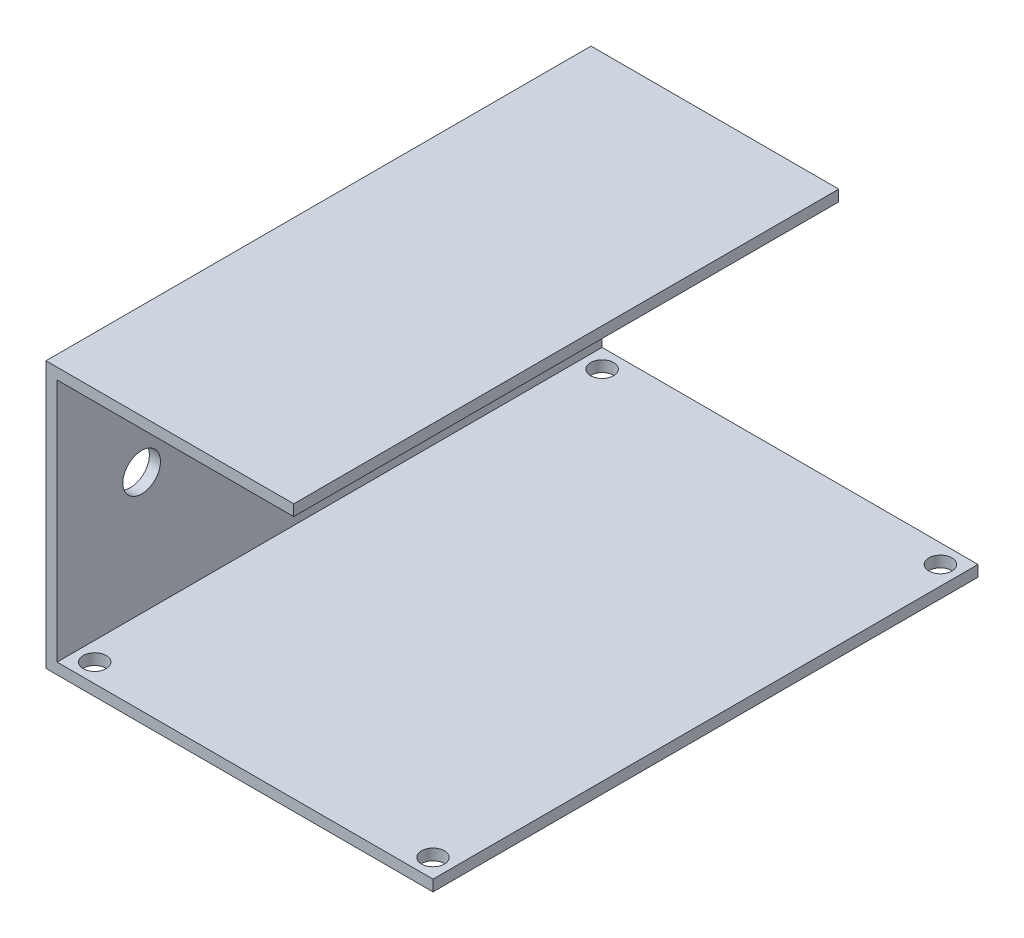
ISO-10303-21;
HEADER;
FILE_DESCRIPTION(('STEP AP214'),'2;1');
FILE_NAME('part.step','',(''),(''),'','','');
FILE_SCHEMA(('AUTOMOTIVE_DESIGN { 1 0 10303 214 1 1 1 1 }'));
ENDSEC;
DATA;
#1=APPLICATION_CONTEXT('core data for automotive mechanical design processes');
#2=APPLICATION_PROTOCOL_DEFINITION('international standard','automotive_design',2000,#1);
#3=PRODUCT_CONTEXT('',#1,'mechanical');
#4=PRODUCT('Part','Part','',(#3));
#5=PRODUCT_RELATED_PRODUCT_CATEGORY('part','',(#4));
#6=PRODUCT_DEFINITION_FORMATION('','',#4);
#7=PRODUCT_DEFINITION_CONTEXT('part definition',#1,'design');
#8=PRODUCT_DEFINITION('design','',#6,#7);
#9=PRODUCT_DEFINITION_SHAPE('','',#8);
#10=(LENGTH_UNIT() NAMED_UNIT(*) SI_UNIT(.MILLI.,.METRE.));
#11=(NAMED_UNIT(*) PLANE_ANGLE_UNIT() SI_UNIT($,.RADIAN.));
#12=(NAMED_UNIT(*) SI_UNIT($,.STERADIAN.) SOLID_ANGLE_UNIT());
#13=UNCERTAINTY_MEASURE_WITH_UNIT(LENGTH_MEASURE(1.E-05),#10,'distance_accuracy_value','');
#14=(GEOMETRIC_REPRESENTATION_CONTEXT(3) GLOBAL_UNCERTAINTY_ASSIGNED_CONTEXT((#13)) GLOBAL_UNIT_ASSIGNED_CONTEXT((#10,
#11,#12)) REPRESENTATION_CONTEXT('',''));
#15=CARTESIAN_POINT('',(0.,0.,0.));
#16=DIRECTION('',(0.,0.,1.));
#17=DIRECTION('',(1.,0.,0.));
#18=AXIS2_PLACEMENT_3D('',#15,#16,#17);
#19=CARTESIAN_POINT('',(-25.4,34.52,-36.83));
#20=DIRECTION('',(-1.,0.,0.));
#21=DIRECTION('',(0.,0.,1.));
#22=AXIS2_PLACEMENT_3D('',#19,#20,#21);
#23=PLANE('',#22);
#24=CARTESIAN_POINT('',(-25.4,18.01,0.));
#25=DIRECTION('',(1.,0.,0.));
#26=DIRECTION('',(0.,0.,-1.));
#27=AXIS2_PLACEMENT_3D('',#24,#25,#26);
#28=CIRCLE('',#27,5.334);
#29=CARTESIAN_POINT('',(-25.4,18.01,-5.334));
#30=VERTEX_POINT('',#29);
#31=EDGE_CURVE('E151',#30,#30,#28,.T.);
#32=ORIENTED_EDGE('',*,*,#31,.F.);
#33=EDGE_LOOP('',(#32));
#34=FACE_BOUND('',#33,.T.);
#35=CARTESIAN_POINT('',(-25.4,18.01,-12.7));
#36=DIRECTION('',(1.,0.,0.));
#37=DIRECTION('',(0.,0.,-1.));
#38=AXIS2_PLACEMENT_3D('',#35,#36,#37);
#39=CIRCLE('',#38,2.54);
#40=CARTESIAN_POINT('',(-25.4,18.01,-15.24));
#41=VERTEX_POINT('',#40);
#42=EDGE_CURVE('E154',#41,#41,#39,.T.);
#43=ORIENTED_EDGE('',*,*,#42,.F.);
#44=EDGE_LOOP('',(#43));
#45=FACE_BOUND('',#44,.T.);
#46=CARTESIAN_POINT('',(-25.4,18.01,-25.4));
#47=DIRECTION('',(1.,0.,0.));
#48=DIRECTION('',(0.,0.,-1.));
#49=AXIS2_PLACEMENT_3D('',#46,#47,#48);
#50=CIRCLE('',#49,2.54);
#51=CARTESIAN_POINT('',(-25.4,18.01,-27.94));
#52=VERTEX_POINT('',#51);
#53=EDGE_CURVE('E162',#52,#52,#50,.T.);
#54=ORIENTED_EDGE('',*,*,#53,.F.);
#55=EDGE_LOOP('',(#54));
#56=FACE_BOUND('',#55,.T.);
#57=CARTESIAN_POINT('',(-25.4,18.01,25.4));
#58=DIRECTION('',(1.,0.,0.));
#59=DIRECTION('',(0.,0.,-1.));
#60=AXIS2_PLACEMENT_3D('',#57,#58,#59);
#61=CIRCLE('',#60,2.54);
#62=CARTESIAN_POINT('',(-25.4,18.01,22.86));
#63=VERTEX_POINT('',#62);
#64=EDGE_CURVE('E158',#63,#63,#61,.T.);
#65=ORIENTED_EDGE('',*,*,#64,.F.);
#66=EDGE_LOOP('',(#65));
#67=FACE_BOUND('',#66,.T.);
#68=CARTESIAN_POINT('',(-25.4,18.01,12.7));
#69=DIRECTION('',(1.,0.,0.));
#70=DIRECTION('',(0.,0.,-1.));
#71=AXIS2_PLACEMENT_3D('',#68,#69,#70);
#72=CIRCLE('',#71,2.54);
#73=CARTESIAN_POINT('',(-25.4,18.01,10.16));
#74=VERTEX_POINT('',#73);
#75=EDGE_CURVE('E155',#74,#74,#72,.T.);
#76=ORIENTED_EDGE('',*,*,#75,.F.);
#77=EDGE_LOOP('',(#76));
#78=FACE_BOUND('',#77,.T.);
#79=DIRECTION('',(0.,0.,-1.));
#80=VECTOR('',#79,1.);
#81=CARTESIAN_POINT('',(-25.4,34.52,36.83));
#82=LINE('',#81,#80);
#83=CARTESIAN_POINT('',(-25.4,34.52,36.83));
#84=VERTEX_POINT('',#83);
#85=CARTESIAN_POINT('',(-25.4,34.52,-36.83));
#86=VERTEX_POINT('',#85);
#87=EDGE_CURVE('E182',#84,#86,#82,.T.);
#88=ORIENTED_EDGE('',*,*,#87,.F.);
#89=DIRECTION('',(0.,-1.,0.));
#90=VECTOR('',#89,1.);
#91=CARTESIAN_POINT('',(-25.4,34.52,36.83));
#92=LINE('',#91,#90);
#93=CARTESIAN_POINT('',(-25.4,1.5,36.83));
#94=VERTEX_POINT('',#93);
#95=EDGE_CURVE('E49',#84,#94,#92,.T.);
#96=ORIENTED_EDGE('',*,*,#95,.T.);
#97=DIRECTION('',(0.,0.,-1.));
#98=VECTOR('',#97,1.);
#99=CARTESIAN_POINT('',(-25.4,1.5,-36.83));
#100=LINE('',#99,#98);
#101=CARTESIAN_POINT('',(-25.4,1.5,-36.83));
#102=VERTEX_POINT('',#101);
#103=EDGE_CURVE('E134',#94,#102,#100,.T.);
#104=ORIENTED_EDGE('',*,*,#103,.T.);
#105=DIRECTION('',(0.,-1.,0.));
#106=VECTOR('',#105,1.);
#107=CARTESIAN_POINT('',(-25.4,34.52,-36.83));
#108=LINE('',#107,#106);
#109=EDGE_CURVE('E132',#86,#102,#108,.T.);
#110=ORIENTED_EDGE('',*,*,#109,.F.);
#111=EDGE_LOOP('',(#88,#96,#104,#110));
#112=FACE_BOUND('',#111,.T.);
#113=ADVANCED_FACE('F34',(#34,#45,#56,#67,#78,#112),#23,.F.);
#114=CARTESIAN_POINT('',(0.,1.5,0.));
#115=DIRECTION('',(0.,1.,0.));
#116=DIRECTION('',(0.,0.,1.));
#117=AXIS2_PLACEMENT_3D('',#114,#115,#116);
#118=PLANE('',#117);
#119=ORIENTED_EDGE('',*,*,#103,.F.);
#120=DIRECTION('',(1.,0.,0.));
#121=VECTOR('',#120,1.);
#122=CARTESIAN_POINT('',(25.4,1.5,36.83));
#123=LINE('',#122,#121);
#124=CARTESIAN_POINT('',(25.4,1.5,36.83));
#125=VERTEX_POINT('',#124);
#126=EDGE_CURVE('E94',#94,#125,#123,.T.);
#127=ORIENTED_EDGE('',*,*,#126,.T.);
#128=DIRECTION('',(0.,0.,-1.));
#129=VECTOR('',#128,1.);
#130=CARTESIAN_POINT('',(25.4,1.5,36.83));
#131=LINE('',#130,#129);
#132=CARTESIAN_POINT('',(25.4,1.5,-36.83));
#133=VERTEX_POINT('',#132);
#134=EDGE_CURVE('E58',#125,#133,#131,.T.);
#135=ORIENTED_EDGE('',*,*,#134,.T.);
#136=DIRECTION('',(-1.,0.,0.));
#137=VECTOR('',#136,1.);
#138=CARTESIAN_POINT('',(25.4,1.5,-36.83));
#139=LINE('',#138,#137);
#140=EDGE_CURVE('E88',#133,#102,#139,.T.);
#141=ORIENTED_EDGE('',*,*,#140,.T.);
#142=EDGE_LOOP('',(#119,#127,#135,#141));
#143=FACE_BOUND('',#142,.T.);
#144=CARTESIAN_POINT('',(22.86,1.5,34.29));
#145=DIRECTION('',(0.,1.,0.));
#146=DIRECTION('',(0.,0.,1.));
#147=AXIS2_PLACEMENT_3D('',#144,#145,#146);
#148=CIRCLE('',#147,1.55);
#149=CARTESIAN_POINT('',(22.86,1.5,35.84));
#150=VERTEX_POINT('',#149);
#151=EDGE_CURVE('E111',#150,#150,#148,.T.);
#152=ORIENTED_EDGE('',*,*,#151,.F.);
#153=EDGE_LOOP('',(#152));
#154=FACE_BOUND('',#153,.T.);
#155=CARTESIAN_POINT('',(-22.86,1.5,-34.29));
#156=DIRECTION('',(0.,1.,0.));
#157=DIRECTION('',(0.,0.,1.));
#158=AXIS2_PLACEMENT_3D('',#155,#156,#157);
#159=CIRCLE('',#158,1.55);
#160=CARTESIAN_POINT('',(-22.86,1.5,-32.74));
#161=VERTEX_POINT('',#160);
#162=EDGE_CURVE('E99',#161,#161,#159,.T.);
#163=ORIENTED_EDGE('',*,*,#162,.F.);
#164=EDGE_LOOP('',(#163));
#165=FACE_BOUND('',#164,.T.);
#166=CARTESIAN_POINT('',(22.86,1.5,-34.29));
#167=DIRECTION('',(0.,1.,0.));
#168=DIRECTION('',(0.,0.,1.));
#169=AXIS2_PLACEMENT_3D('',#166,#167,#168);
#170=CIRCLE('',#169,1.55);
#171=CARTESIAN_POINT('',(22.86,1.5,-32.74));
#172=VERTEX_POINT('',#171);
#173=EDGE_CURVE('E105',#172,#172,#170,.T.);
#174=ORIENTED_EDGE('',*,*,#173,.F.);
#175=EDGE_LOOP('',(#174));
#176=FACE_BOUND('',#175,.T.);
#177=CARTESIAN_POINT('',(-22.86,1.5,34.29));
#178=DIRECTION('',(0.,1.,0.));
#179=DIRECTION('',(0.,0.,1.));
#180=AXIS2_PLACEMENT_3D('',#177,#178,#179);
#181=CIRCLE('',#180,1.55);
#182=CARTESIAN_POINT('',(-22.86,1.5,35.84));
#183=VERTEX_POINT('',#182);
#184=EDGE_CURVE('E117',#183,#183,#181,.T.);
#185=ORIENTED_EDGE('',*,*,#184,.F.);
#186=EDGE_LOOP('',(#185));
#187=FACE_BOUND('',#186,.T.);
#188=ADVANCED_FACE('F220',(#143,#154,#165,#176,#187),#118,.T.);
#189=CARTESIAN_POINT('',(0.,0.,0.));
#190=DIRECTION('',(0.,1.,0.));
#191=DIRECTION('',(0.,0.,1.));
#192=AXIS2_PLACEMENT_3D('',#189,#190,#191);
#193=PLANE('',#192);
#194=DIRECTION('',(1.,0.,0.));
#195=VECTOR('',#194,1.);
#196=CARTESIAN_POINT('',(25.4,0.,36.83));
#197=LINE('',#196,#195);
#198=CARTESIAN_POINT('',(-26.9,0.,36.83));
#199=VERTEX_POINT('',#198);
#200=CARTESIAN_POINT('',(25.4,0.,36.83));
#201=VERTEX_POINT('',#200);
#202=EDGE_CURVE('E79',#199,#201,#197,.T.);
#203=ORIENTED_EDGE('',*,*,#202,.F.);
#204=DIRECTION('',(0.,0.,1.));
#205=VECTOR('',#204,1.);
#206=CARTESIAN_POINT('',(-26.9,0.,-36.83));
#207=LINE('',#206,#205);
#208=CARTESIAN_POINT('',(-26.9,0.,-36.83));
#209=VERTEX_POINT('',#208);
#210=EDGE_CURVE('E92',#209,#199,#207,.T.);
#211=ORIENTED_EDGE('',*,*,#210,.F.);
#212=DIRECTION('',(-1.,0.,0.));
#213=VECTOR('',#212,1.);
#214=CARTESIAN_POINT('',(25.4,0.,-36.83));
#215=LINE('',#214,#213);
#216=CARTESIAN_POINT('',(25.4,0.,-36.83));
#217=VERTEX_POINT('',#216);
#218=EDGE_CURVE('E78',#217,#209,#215,.T.);
#219=ORIENTED_EDGE('',*,*,#218,.F.);
#220=DIRECTION('',(0.,0.,-1.));
#221=VECTOR('',#220,1.);
#222=CARTESIAN_POINT('',(25.4,0.,36.83));
#223=LINE('',#222,#221);
#224=EDGE_CURVE('E70',#201,#217,#223,.T.);
#225=ORIENTED_EDGE('',*,*,#224,.F.);
#226=EDGE_LOOP('',(#203,#211,#219,#225));
#227=FACE_BOUND('',#226,.T.);
#228=CARTESIAN_POINT('',(-22.86,0.,-34.29));
#229=DIRECTION('',(0.,1.,0.));
#230=DIRECTION('',(0.,0.,1.));
#231=AXIS2_PLACEMENT_3D('',#228,#229,#230);
#232=CIRCLE('',#231,1.55);
#233=CARTESIAN_POINT('',(-22.86,0.,-32.74));
#234=VERTEX_POINT('',#233);
#235=EDGE_CURVE('E102',#234,#234,#232,.T.);
#236=ORIENTED_EDGE('',*,*,#235,.T.);
#237=EDGE_LOOP('',(#236));
#238=FACE_BOUND('',#237,.T.);
#239=CARTESIAN_POINT('',(22.86,0.,-34.29));
#240=DIRECTION('',(0.,1.,0.));
#241=DIRECTION('',(0.,0.,1.));
#242=AXIS2_PLACEMENT_3D('',#239,#240,#241);
#243=CIRCLE('',#242,1.55);
#244=CARTESIAN_POINT('',(22.86,0.,-32.74));
#245=VERTEX_POINT('',#244);
#246=EDGE_CURVE('E108',#245,#245,#243,.T.);
#247=ORIENTED_EDGE('',*,*,#246,.T.);
#248=EDGE_LOOP('',(#247));
#249=FACE_BOUND('',#248,.T.);
#250=CARTESIAN_POINT('',(22.86,0.,34.29));
#251=DIRECTION('',(0.,1.,0.));
#252=DIRECTION('',(0.,0.,1.));
#253=AXIS2_PLACEMENT_3D('',#250,#251,#252);
#254=CIRCLE('',#253,1.55);
#255=CARTESIAN_POINT('',(22.86,0.,35.84));
#256=VERTEX_POINT('',#255);
#257=EDGE_CURVE('E114',#256,#256,#254,.T.);
#258=ORIENTED_EDGE('',*,*,#257,.T.);
#259=EDGE_LOOP('',(#258));
#260=FACE_BOUND('',#259,.T.);
#261=CARTESIAN_POINT('',(-22.86,0.,34.29));
#262=DIRECTION('',(0.,1.,0.));
#263=DIRECTION('',(0.,0.,1.));
#264=AXIS2_PLACEMENT_3D('',#261,#262,#263);
#265=CIRCLE('',#264,1.55);
#266=CARTESIAN_POINT('',(-22.86,0.,35.84));
#267=VERTEX_POINT('',#266);
#268=EDGE_CURVE('E120',#267,#267,#265,.T.);
#269=ORIENTED_EDGE('',*,*,#268,.T.);
#270=EDGE_LOOP('',(#269));
#271=FACE_BOUND('',#270,.T.);
#272=ADVANCED_FACE('F89',(#227,#238,#249,#260,#271),#193,.F.);
#273=CARTESIAN_POINT('',(25.4,1.5,36.83));
#274=DIRECTION('',(0.,0.,-1.));
#275=DIRECTION('',(-1.,0.,0.));
#276=AXIS2_PLACEMENT_3D('',#273,#274,#275);
#277=PLANE('',#276);
#278=ORIENTED_EDGE('',*,*,#202,.T.);
#279=DIRECTION('',(0.,-1.,0.));
#280=VECTOR('',#279,1.);
#281=CARTESIAN_POINT('',(25.4,1.5,36.83));
#282=LINE('',#281,#280);
#283=EDGE_CURVE('E11',#125,#201,#282,.T.);
#284=ORIENTED_EDGE('',*,*,#283,.F.);
#285=ORIENTED_EDGE('',*,*,#126,.F.);
#286=ORIENTED_EDGE('',*,*,#95,.F.);
#287=DIRECTION('',(-1.,0.,0.));
#288=VECTOR('',#287,1.);
#289=CARTESIAN_POINT('',(6.58000000000006,34.52,36.83));
#290=LINE('',#289,#288);
#291=CARTESIAN_POINT('',(6.58000000000006,34.52,36.83));
#292=VERTEX_POINT('',#291);
#293=EDGE_CURVE('E175',#292,#84,#290,.T.);
#294=ORIENTED_EDGE('',*,*,#293,.F.);
#295=DIRECTION('',(0.,-1.,0.));
#296=VECTOR('',#295,1.);
#297=CARTESIAN_POINT('',(6.58000000000006,36.02,36.83));
#298=LINE('',#297,#296);
#299=CARTESIAN_POINT('',(6.58000000000006,36.02,36.83));
#300=VERTEX_POINT('',#299);
#301=EDGE_CURVE('E185',#300,#292,#298,.T.);
#302=ORIENTED_EDGE('',*,*,#301,.F.);
#303=DIRECTION('',(1.,0.,0.));
#304=VECTOR('',#303,1.);
#305=CARTESIAN_POINT('',(-26.9,36.02,36.83));
#306=LINE('',#305,#304);
#307=CARTESIAN_POINT('',(-26.9,36.02,36.83));
#308=VERTEX_POINT('',#307);
#309=EDGE_CURVE('E169',#308,#300,#306,.T.);
#310=ORIENTED_EDGE('',*,*,#309,.F.);
#311=DIRECTION('',(0.,1.,0.));
#312=VECTOR('',#311,1.);
#313=CARTESIAN_POINT('',(-26.9,1.5,36.83));
#314=LINE('',#313,#312);
#315=EDGE_CURVE('E123',#199,#308,#314,.T.);
#316=ORIENTED_EDGE('',*,*,#315,.F.);
#317=EDGE_LOOP('',(#278,#284,#285,#286,#294,#302,#310,#316));
#318=FACE_BOUND('',#317,.T.);
#319=ADVANCED_FACE('F36',(#318),#277,.F.);
#320=CARTESIAN_POINT('',(25.4,1.5,36.83));
#321=DIRECTION('',(-1.,0.,0.));
#322=DIRECTION('',(0.,0.,1.));
#323=AXIS2_PLACEMENT_3D('',#320,#321,#322);
#324=PLANE('',#323);
#325=ORIENTED_EDGE('',*,*,#224,.T.);
#326=DIRECTION('',(0.,-1.,0.));
#327=VECTOR('',#326,1.);
#328=CARTESIAN_POINT('',(25.4,1.5,-36.83));
#329=LINE('',#328,#327);
#330=EDGE_CURVE('E42',#133,#217,#329,.T.);
#331=ORIENTED_EDGE('',*,*,#330,.F.);
#332=ORIENTED_EDGE('',*,*,#134,.F.);
#333=ORIENTED_EDGE('',*,*,#283,.T.);
#334=EDGE_LOOP('',(#325,#331,#332,#333));
#335=FACE_BOUND('',#334,.T.);
#336=ADVANCED_FACE('F72',(#335),#324,.F.);
#337=CARTESIAN_POINT('',(25.4,1.5,-36.83));
#338=DIRECTION('',(0.,0.,1.));
#339=DIRECTION('',(1.,0.,0.));
#340=AXIS2_PLACEMENT_3D('',#337,#338,#339);
#341=PLANE('',#340);
#342=ORIENTED_EDGE('',*,*,#218,.T.);
#343=DIRECTION('',(0.,-1.,0.));
#344=VECTOR('',#343,1.);
#345=CARTESIAN_POINT('',(-26.9,1.5,-36.83));
#346=LINE('',#345,#344);
#347=CARTESIAN_POINT('',(-26.9,36.02,-36.83));
#348=VERTEX_POINT('',#347);
#349=EDGE_CURVE('E129',#348,#209,#346,.T.);
#350=ORIENTED_EDGE('',*,*,#349,.F.);
#351=DIRECTION('',(-1.,0.,0.));
#352=VECTOR('',#351,1.);
#353=CARTESIAN_POINT('',(-26.9,36.02,-36.83));
#354=LINE('',#353,#352);
#355=CARTESIAN_POINT('',(6.58000000000004,36.02,-36.83));
#356=VERTEX_POINT('',#355);
#357=EDGE_CURVE('E159',#356,#348,#354,.T.);
#358=ORIENTED_EDGE('',*,*,#357,.F.);
#359=DIRECTION('',(0.,1.,0.));
#360=VECTOR('',#359,1.);
#361=CARTESIAN_POINT('',(6.58000000000004,36.02,-36.83));
#362=LINE('',#361,#360);
#363=CARTESIAN_POINT('',(6.58000000000004,34.52,-36.83));
#364=VERTEX_POINT('',#363);
#365=EDGE_CURVE('E188',#364,#356,#362,.T.);
#366=ORIENTED_EDGE('',*,*,#365,.F.);
#367=DIRECTION('',(-1.,0.,0.));
#368=VECTOR('',#367,1.);
#369=CARTESIAN_POINT('',(6.58000000000004,34.52,-36.83));
#370=LINE('',#369,#368);
#371=EDGE_CURVE('E178',#364,#86,#370,.T.);
#372=ORIENTED_EDGE('',*,*,#371,.T.);
#373=ORIENTED_EDGE('',*,*,#109,.T.);
#374=ORIENTED_EDGE('',*,*,#140,.F.);
#375=ORIENTED_EDGE('',*,*,#330,.T.);
#376=EDGE_LOOP('',(#342,#350,#358,#366,#372,#373,#374,#375));
#377=FACE_BOUND('',#376,.T.);
#378=ADVANCED_FACE('F83',(#377),#341,.F.);
#379=CARTESIAN_POINT('',(-22.86,1.5,-34.29));
#380=DIRECTION('',(0.,-1.,0.));
#381=DIRECTION('',(0.,0.,-1.));
#382=AXIS2_PLACEMENT_3D('',#379,#380,#381);
#383=CYLINDRICAL_SURFACE('',#382,1.55);
#384=ORIENTED_EDGE('',*,*,#162,.T.);
#385=EDGE_LOOP('',(#384));
#386=FACE_BOUND('',#385,.T.);
#387=ORIENTED_EDGE('',*,*,#235,.F.);
#388=EDGE_LOOP('',(#387));
#389=FACE_BOUND('',#388,.T.);
#390=ADVANCED_FACE('F275',(#386,#389),#383,.F.);
#391=CARTESIAN_POINT('',(22.86,1.5,-34.29));
#392=DIRECTION('',(0.,-1.,0.));
#393=DIRECTION('',(0.,0.,-1.));
#394=AXIS2_PLACEMENT_3D('',#391,#392,#393);
#395=CYLINDRICAL_SURFACE('',#394,1.55);
#396=ORIENTED_EDGE('',*,*,#173,.T.);
#397=EDGE_LOOP('',(#396));
#398=FACE_BOUND('',#397,.T.);
#399=ORIENTED_EDGE('',*,*,#246,.F.);
#400=EDGE_LOOP('',(#399));
#401=FACE_BOUND('',#400,.T.);
#402=ADVANCED_FACE('F271',(#398,#401),#395,.F.);
#403=CARTESIAN_POINT('',(22.86,1.5,34.29));
#404=DIRECTION('',(0.,-1.,0.));
#405=DIRECTION('',(0.,0.,-1.));
#406=AXIS2_PLACEMENT_3D('',#403,#404,#405);
#407=CYLINDRICAL_SURFACE('',#406,1.55);
#408=ORIENTED_EDGE('',*,*,#151,.T.);
#409=EDGE_LOOP('',(#408));
#410=FACE_BOUND('',#409,.T.);
#411=ORIENTED_EDGE('',*,*,#257,.F.);
#412=EDGE_LOOP('',(#411));
#413=FACE_BOUND('',#412,.T.);
#414=ADVANCED_FACE('F267',(#410,#413),#407,.F.);
#415=CARTESIAN_POINT('',(-22.86,1.5,34.29));
#416=DIRECTION('',(0.,-1.,0.));
#417=DIRECTION('',(0.,0.,-1.));
#418=AXIS2_PLACEMENT_3D('',#415,#416,#417);
#419=CYLINDRICAL_SURFACE('',#418,1.55);
#420=ORIENTED_EDGE('',*,*,#184,.T.);
#421=EDGE_LOOP('',(#420));
#422=FACE_BOUND('',#421,.T.);
#423=ORIENTED_EDGE('',*,*,#268,.F.);
#424=EDGE_LOOP('',(#423));
#425=FACE_BOUND('',#424,.T.);
#426=ADVANCED_FACE('F263',(#422,#425),#419,.F.);
#427=CARTESIAN_POINT('',(-26.9,0.,0.));
#428=DIRECTION('',(-1.,0.,0.));
#429=DIRECTION('',(0.,0.,1.));
#430=AXIS2_PLACEMENT_3D('',#427,#428,#429);
#431=PLANE('',#430);
#432=CARTESIAN_POINT('',(-26.9,18.01,12.7));
#433=DIRECTION('',(-1.,0.,0.));
#434=DIRECTION('',(0.,0.,1.));
#435=AXIS2_PLACEMENT_3D('',#432,#433,#434);
#436=CIRCLE('',#435,2.54);
#437=CARTESIAN_POINT('',(-26.9,18.01,15.24));
#438=VERTEX_POINT('',#437);
#439=EDGE_CURVE('E136',#438,#438,#436,.T.);
#440=ORIENTED_EDGE('',*,*,#439,.F.);
#441=EDGE_LOOP('',(#440));
#442=FACE_BOUND('',#441,.T.);
#443=CARTESIAN_POINT('',(-26.9,18.01,25.4));
#444=DIRECTION('',(-1.,0.,0.));
#445=DIRECTION('',(0.,0.,1.));
#446=AXIS2_PLACEMENT_3D('',#443,#444,#445);
#447=CIRCLE('',#446,2.54);
#448=CARTESIAN_POINT('',(-26.9,18.01,27.94));
#449=VERTEX_POINT('',#448);
#450=EDGE_CURVE('E139',#449,#449,#447,.T.);
#451=ORIENTED_EDGE('',*,*,#450,.F.);
#452=EDGE_LOOP('',(#451));
#453=FACE_BOUND('',#452,.T.);
#454=CARTESIAN_POINT('',(-26.9,18.01,-25.4));
#455=DIRECTION('',(-1.,0.,0.));
#456=DIRECTION('',(0.,0.,1.));
#457=AXIS2_PLACEMENT_3D('',#454,#455,#456);
#458=CIRCLE('',#457,2.54);
#459=CARTESIAN_POINT('',(-26.9,18.01,-22.86));
#460=VERTEX_POINT('',#459);
#461=EDGE_CURVE('E142',#460,#460,#458,.T.);
#462=ORIENTED_EDGE('',*,*,#461,.F.);
#463=EDGE_LOOP('',(#462));
#464=FACE_BOUND('',#463,.T.);
#465=CARTESIAN_POINT('',(-26.9,18.01,-12.7));
#466=DIRECTION('',(-1.,0.,0.));
#467=DIRECTION('',(0.,0.,1.));
#468=AXIS2_PLACEMENT_3D('',#465,#466,#467);
#469=CIRCLE('',#468,2.54);
#470=CARTESIAN_POINT('',(-26.9,18.01,-10.16));
#471=VERTEX_POINT('',#470);
#472=EDGE_CURVE('E145',#471,#471,#469,.T.);
#473=ORIENTED_EDGE('',*,*,#472,.F.);
#474=EDGE_LOOP('',(#473));
#475=FACE_BOUND('',#474,.T.);
#476=CARTESIAN_POINT('',(-26.9,18.01,0.));
#477=DIRECTION('',(-1.,0.,0.));
#478=DIRECTION('',(0.,0.,1.));
#479=AXIS2_PLACEMENT_3D('',#476,#477,#478);
#480=CIRCLE('',#479,5.334);
#481=CARTESIAN_POINT('',(-26.9,18.01,5.334));
#482=VERTEX_POINT('',#481);
#483=EDGE_CURVE('E148',#482,#482,#480,.T.);
#484=ORIENTED_EDGE('',*,*,#483,.F.);
#485=EDGE_LOOP('',(#484));
#486=FACE_BOUND('',#485,.T.);
#487=ORIENTED_EDGE('',*,*,#349,.T.);
#488=ORIENTED_EDGE('',*,*,#210,.T.);
#489=ORIENTED_EDGE('',*,*,#315,.T.);
#490=DIRECTION('',(0.,0.,1.));
#491=VECTOR('',#490,1.);
#492=CARTESIAN_POINT('',(-26.9,36.02,-36.83));
#493=LINE('',#492,#491);
#494=EDGE_CURVE('E172',#348,#308,#493,.T.);
#495=ORIENTED_EDGE('',*,*,#494,.F.);
#496=EDGE_LOOP('',(#487,#488,#489,#495));
#497=FACE_BOUND('',#496,.T.);
#498=ADVANCED_FACE('F224',(#442,#453,#464,#475,#486,#497),#431,.T.);
#499=CARTESIAN_POINT('',(-58.42,18.01,0.));
#500=DIRECTION('',(1.,0.,0.));
#501=DIRECTION('',(0.,0.,-1.));
#502=AXIS2_PLACEMENT_3D('',#499,#500,#501);
#503=CYLINDRICAL_SURFACE('',#502,5.334);
#504=ORIENTED_EDGE('',*,*,#483,.T.);
#505=EDGE_LOOP('',(#504));
#506=FACE_BOUND('',#505,.T.);
#507=ORIENTED_EDGE('',*,*,#31,.T.);
#508=EDGE_LOOP('',(#507));
#509=FACE_BOUND('',#508,.T.);
#510=ADVANCED_FACE('F260',(#506,#509),#503,.F.);
#511=CARTESIAN_POINT('',(-58.42,18.01,-12.7));
#512=DIRECTION('',(1.,0.,0.));
#513=DIRECTION('',(0.,0.,-1.));
#514=AXIS2_PLACEMENT_3D('',#511,#512,#513);
#515=CYLINDRICAL_SURFACE('',#514,2.54);
#516=ORIENTED_EDGE('',*,*,#472,.T.);
#517=EDGE_LOOP('',(#516));
#518=FACE_BOUND('',#517,.T.);
#519=ORIENTED_EDGE('',*,*,#42,.T.);
#520=EDGE_LOOP('',(#519));
#521=FACE_BOUND('',#520,.T.);
#522=ADVANCED_FACE('F310',(#518,#521),#515,.F.);
#523=CARTESIAN_POINT('',(-58.42,18.01,-25.4));
#524=DIRECTION('',(1.,0.,0.));
#525=DIRECTION('',(0.,0.,-1.));
#526=AXIS2_PLACEMENT_3D('',#523,#524,#525);
#527=CYLINDRICAL_SURFACE('',#526,2.54);
#528=ORIENTED_EDGE('',*,*,#461,.T.);
#529=EDGE_LOOP('',(#528));
#530=FACE_BOUND('',#529,.T.);
#531=ORIENTED_EDGE('',*,*,#53,.T.);
#532=EDGE_LOOP('',(#531));
#533=FACE_BOUND('',#532,.T.);
#534=ADVANCED_FACE('F320',(#530,#533),#527,.F.);
#535=CARTESIAN_POINT('',(-58.42,18.01,25.4));
#536=DIRECTION('',(1.,0.,0.));
#537=DIRECTION('',(0.,0.,-1.));
#538=AXIS2_PLACEMENT_3D('',#535,#536,#537);
#539=CYLINDRICAL_SURFACE('',#538,2.54);
#540=ORIENTED_EDGE('',*,*,#450,.T.);
#541=EDGE_LOOP('',(#540));
#542=FACE_BOUND('',#541,.T.);
#543=ORIENTED_EDGE('',*,*,#64,.T.);
#544=EDGE_LOOP('',(#543));
#545=FACE_BOUND('',#544,.T.);
#546=ADVANCED_FACE('F245',(#542,#545),#539,.F.);
#547=CARTESIAN_POINT('',(-58.42,18.01,12.7));
#548=DIRECTION('',(1.,0.,0.));
#549=DIRECTION('',(0.,0.,-1.));
#550=AXIS2_PLACEMENT_3D('',#547,#548,#549);
#551=CYLINDRICAL_SURFACE('',#550,2.54);
#552=ORIENTED_EDGE('',*,*,#439,.T.);
#553=EDGE_LOOP('',(#552));
#554=FACE_BOUND('',#553,.T.);
#555=ORIENTED_EDGE('',*,*,#75,.T.);
#556=EDGE_LOOP('',(#555));
#557=FACE_BOUND('',#556,.T.);
#558=ADVANCED_FACE('F238',(#554,#557),#551,.F.);
#559=CARTESIAN_POINT('',(0.,36.02,0.));
#560=DIRECTION('',(0.,1.,0.));
#561=DIRECTION('',(0.,0.,1.));
#562=AXIS2_PLACEMENT_3D('',#559,#560,#561);
#563=PLANE('',#562);
#564=ORIENTED_EDGE('',*,*,#494,.T.);
#565=ORIENTED_EDGE('',*,*,#309,.T.);
#566=DIRECTION('',(0.,0.,1.));
#567=VECTOR('',#566,1.);
#568=CARTESIAN_POINT('',(6.58000000000006,36.02,36.83));
#569=LINE('',#568,#567);
#570=EDGE_CURVE('E181',#356,#300,#569,.T.);
#571=ORIENTED_EDGE('',*,*,#570,.F.);
#572=ORIENTED_EDGE('',*,*,#357,.T.);
#573=EDGE_LOOP('',(#564,#565,#571,#572));
#574=FACE_BOUND('',#573,.T.);
#575=ADVANCED_FACE('F232',(#574),#563,.T.);
#576=CARTESIAN_POINT('',(6.58000000000006,34.52,36.83));
#577=DIRECTION('',(0.,1.,0.));
#578=DIRECTION('',(0.,0.,1.));
#579=AXIS2_PLACEMENT_3D('',#576,#577,#578);
#580=PLANE('',#579);
#581=ORIENTED_EDGE('',*,*,#87,.T.);
#582=ORIENTED_EDGE('',*,*,#371,.F.);
#583=DIRECTION('',(0.,0.,-1.));
#584=VECTOR('',#583,1.);
#585=CARTESIAN_POINT('',(6.58000000000006,34.52,36.83));
#586=LINE('',#585,#584);
#587=EDGE_CURVE('E191',#292,#364,#586,.T.);
#588=ORIENTED_EDGE('',*,*,#587,.F.);
#589=ORIENTED_EDGE('',*,*,#293,.T.);
#590=EDGE_LOOP('',(#581,#582,#588,#589));
#591=FACE_BOUND('',#590,.T.);
#592=ADVANCED_FACE('F212',(#591),#580,.F.);
#593=CARTESIAN_POINT('',(6.58000000000005,0.,0.));
#594=DIRECTION('',(1.,0.,0.));
#595=DIRECTION('',(0.,0.,-1.));
#596=AXIS2_PLACEMENT_3D('',#593,#594,#595);
#597=PLANE('',#596);
#598=ORIENTED_EDGE('',*,*,#301,.T.);
#599=ORIENTED_EDGE('',*,*,#587,.T.);
#600=ORIENTED_EDGE('',*,*,#365,.T.);
#601=ORIENTED_EDGE('',*,*,#570,.T.);
#602=EDGE_LOOP('',(#598,#599,#600,#601));
#603=FACE_BOUND('',#602,.T.);
#604=ADVANCED_FACE('F199',(#603),#597,.T.);
#605=CLOSED_SHELL('',(#113,#188,#272,#319,#336,#378,#390,#402,#414,#426,#498,#510,#522,#534,
#546,#558,#575,#592,#604));
#606=MANIFOLD_SOLID_BREP('B2',#605);
#607=ADVANCED_BREP_SHAPE_REPRESENTATION('',(#18,#606),#14);
#608=SHAPE_DEFINITION_REPRESENTATION(#9,#607);
ENDSEC;
END-ISO-10303-21;
